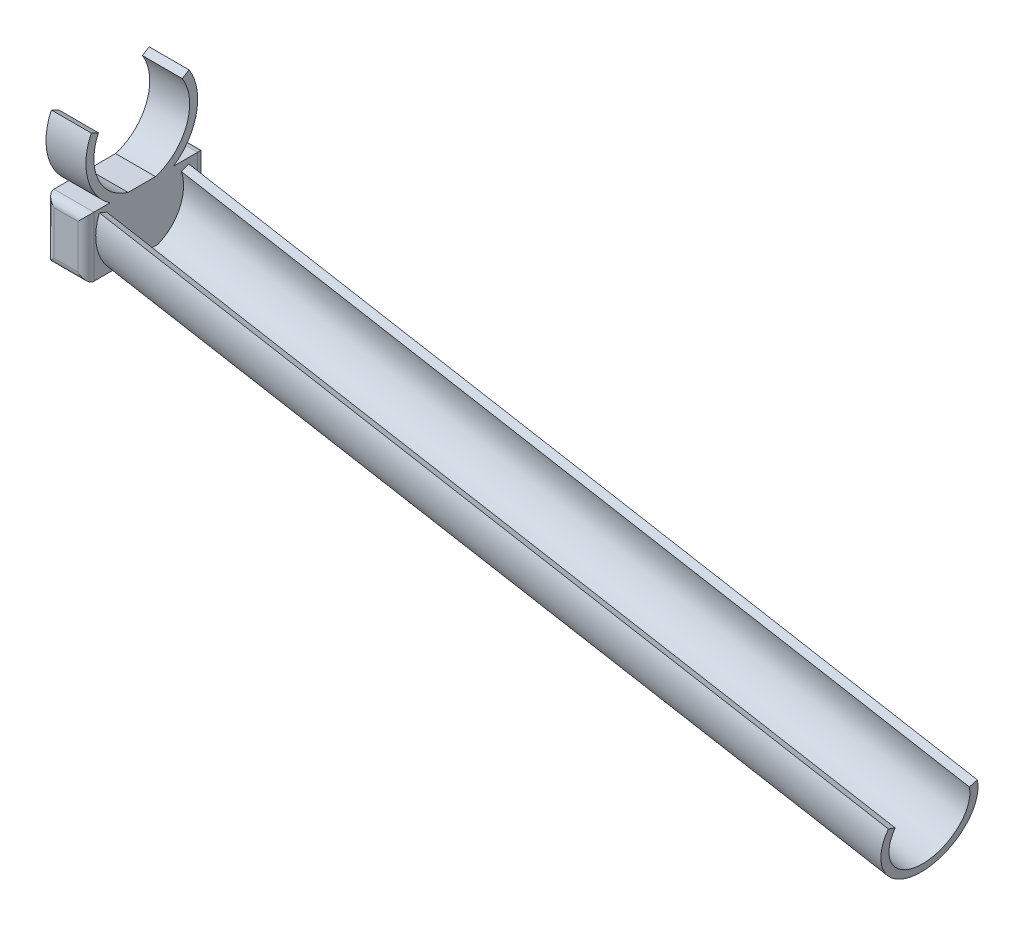
ISO-10303-21;
HEADER;
FILE_DESCRIPTION(('STEP AP214'),'2;1');
FILE_NAME('part.step','',(''),(''),'','','');
FILE_SCHEMA(('AUTOMOTIVE_DESIGN { 1 0 10303 214 1 1 1 1 }'));
ENDSEC;
DATA;
#1=APPLICATION_CONTEXT('core data for automotive mechanical design processes');
#2=APPLICATION_PROTOCOL_DEFINITION('international standard','automotive_design',2000,#1);
#3=PRODUCT_CONTEXT('',#1,'mechanical');
#4=PRODUCT('Part','Part','',(#3));
#5=PRODUCT_RELATED_PRODUCT_CATEGORY('part','',(#4));
#6=PRODUCT_DEFINITION_FORMATION('','',#4);
#7=PRODUCT_DEFINITION_CONTEXT('part definition',#1,'design');
#8=PRODUCT_DEFINITION('design','',#6,#7);
#9=PRODUCT_DEFINITION_SHAPE('','',#8);
#10=(LENGTH_UNIT() NAMED_UNIT(*) SI_UNIT(.MILLI.,.METRE.));
#11=(NAMED_UNIT(*) PLANE_ANGLE_UNIT() SI_UNIT($,.RADIAN.));
#12=(NAMED_UNIT(*) SI_UNIT($,.STERADIAN.) SOLID_ANGLE_UNIT());
#13=UNCERTAINTY_MEASURE_WITH_UNIT(LENGTH_MEASURE(1.E-05),#10,'distance_accuracy_value','');
#14=(GEOMETRIC_REPRESENTATION_CONTEXT(3) GLOBAL_UNCERTAINTY_ASSIGNED_CONTEXT((#13)) GLOBAL_UNIT_ASSIGNED_CONTEXT((#10,
#11,#12)) REPRESENTATION_CONTEXT('',''));
#15=CARTESIAN_POINT('',(0.,0.,0.));
#16=DIRECTION('',(0.,0.,1.));
#17=DIRECTION('',(1.,0.,0.));
#18=AXIS2_PLACEMENT_3D('',#15,#16,#17);
#19=CARTESIAN_POINT('',(10.,0.,0.));
#20=DIRECTION('',(-1.,0.,0.));
#21=DIRECTION('',(0.,0.,1.));
#22=AXIS2_PLACEMENT_3D('',#19,#20,#21);
#23=CYLINDRICAL_SURFACE('',#22,14.);
#24=DIRECTION('',(-1.,0.,0.));
#25=VECTOR('',#24,1.);
#26=CARTESIAN_POINT('',(10.,-11.5,7.98435971133566));
#27=LINE('',#26,#25);
#28=CARTESIAN_POINT('',(10.,-11.5,7.98435971133566));
#29=VERTEX_POINT('',#28);
#30=CARTESIAN_POINT('',(0.,-11.5,7.98435971133566));
#31=VERTEX_POINT('',#30);
#32=EDGE_CURVE('E275',#29,#31,#27,.T.);
#33=ORIENTED_EDGE('',*,*,#32,.F.);
#34=CARTESIAN_POINT('',(10.,0.,0.));
#35=DIRECTION('',(1.,0.,0.));
#36=DIRECTION('',(0.,0.,-1.));
#37=AXIS2_PLACEMENT_3D('',#34,#35,#36);
#38=CIRCLE('',#37,14.);
#39=CARTESIAN_POINT('',(10.,5.99003358971207,12.6538333161979));
#40=VERTEX_POINT('',#39);
#41=EDGE_CURVE('E279',#40,#29,#38,.T.);
#42=ORIENTED_EDGE('',*,*,#41,.F.);
#43=DIRECTION('',(-1.,0.,0.));
#44=VECTOR('',#43,1.);
#45=CARTESIAN_POINT('',(10.,5.99003358971207,12.6538333161979));
#46=LINE('',#45,#44);
#47=CARTESIAN_POINT('',(0.,5.99003358971207,12.6538333161979));
#48=VERTEX_POINT('',#47);
#49=EDGE_CURVE('E293',#40,#48,#46,.T.);
#50=ORIENTED_EDGE('',*,*,#49,.T.);
#51=CARTESIAN_POINT('',(0.,0.,0.));
#52=DIRECTION('',(1.,0.,0.));
#53=DIRECTION('',(0.,0.,-1.));
#54=AXIS2_PLACEMENT_3D('',#51,#52,#53);
#55=CIRCLE('',#54,14.);
#56=EDGE_CURVE('E294',#48,#31,#55,.T.);
#57=ORIENTED_EDGE('',*,*,#56,.T.);
#58=EDGE_LOOP('',(#33,#42,#50,#57));
#59=FACE_BOUND('',#58,.T.);
#60=ADVANCED_FACE('F43',(#59),#23,.T.);
#61=DIRECTION('',(-1.,0.,0.));
#62=VECTOR('',#61,1.);
#63=CARTESIAN_POINT('',(10.,-11.5,-7.98435971133566));
#64=LINE('',#63,#62);
#65=CARTESIAN_POINT('',(0.,-11.5,-7.98435971133566));
#66=VERTEX_POINT('',#65);
#67=CARTESIAN_POINT('',(10.,-11.5,-7.98435971133566));
#68=VERTEX_POINT('',#67);
#69=EDGE_CURVE('E272',#66,#68,#64,.F.);
#70=ORIENTED_EDGE('',*,*,#69,.F.);
#71=CARTESIAN_POINT('',(0.,7.46112155775379,-11.846166683802));
#72=VERTEX_POINT('',#71);
#73=EDGE_CURVE('E278',#66,#72,#55,.T.);
#74=ORIENTED_EDGE('',*,*,#73,.T.);
#75=DIRECTION('',(-1.,0.,0.));
#76=VECTOR('',#75,1.);
#77=CARTESIAN_POINT('',(10.,7.46112155775379,-11.846166683802));
#78=LINE('',#77,#76);
#79=CARTESIAN_POINT('',(10.,7.46112155775379,-11.846166683802));
#80=VERTEX_POINT('',#79);
#81=EDGE_CURVE('E313',#80,#72,#78,.T.);
#82=ORIENTED_EDGE('',*,*,#81,.F.);
#83=EDGE_CURVE('E283',#68,#80,#38,.T.);
#84=ORIENTED_EDGE('',*,*,#83,.F.);
#85=EDGE_LOOP('',(#70,#74,#82,#84));
#86=FACE_BOUND('',#85,.T.);
#87=ADVANCED_FACE('F399',(#86),#23,.T.);
#88=CARTESIAN_POINT('',(10.,0.,0.));
#89=DIRECTION('',(-1.,0.,0.));
#90=DIRECTION('',(0.,0.,1.));
#91=AXIS2_PLACEMENT_3D('',#88,#89,#90);
#92=CYLINDRICAL_SURFACE('',#91,12.);
#93=CARTESIAN_POINT('',(10.,0.,0.));
#94=DIRECTION('',(1.,0.,0.));
#95=DIRECTION('',(0.,0.,-1.));
#96=AXIS2_PLACEMENT_3D('',#93,#94,#95);
#97=CIRCLE('',#96,12.);
#98=CARTESIAN_POINT('',(10.,5.13431450546749,10.8461428424554));
#99=VERTEX_POINT('',#98);
#100=CARTESIAN_POINT('',(10.,-11.5,3.42782730020053));
#101=VERTEX_POINT('',#100);
#102=EDGE_CURVE('E287',#99,#101,#97,.T.);
#103=ORIENTED_EDGE('',*,*,#102,.T.);
#104=DIRECTION('',(-1.,0.,0.));
#105=VECTOR('',#104,1.);
#106=CARTESIAN_POINT('',(10.,-11.5,3.42782730020052));
#107=LINE('',#106,#105);
#108=CARTESIAN_POINT('',(0.,-11.5,3.42782730020053));
#109=VERTEX_POINT('',#108);
#110=EDGE_CURVE('E269',#101,#109,#107,.T.);
#111=ORIENTED_EDGE('',*,*,#110,.T.);
#112=CARTESIAN_POINT('',(0.,0.,0.));
#113=DIRECTION('',(1.,0.,0.));
#114=DIRECTION('',(0.,0.,-1.));
#115=AXIS2_PLACEMENT_3D('',#112,#113,#114);
#116=CIRCLE('',#115,12.);
#117=CARTESIAN_POINT('',(0.,5.13431450546749,10.8461428424554));
#118=VERTEX_POINT('',#117);
#119=EDGE_CURVE('E301',#118,#109,#116,.T.);
#120=ORIENTED_EDGE('',*,*,#119,.F.);
#121=DIRECTION('',(-1.,0.,0.));
#122=VECTOR('',#121,1.);
#123=CARTESIAN_POINT('',(10.,5.13431450546749,10.8461428424554));
#124=LINE('',#123,#122);
#125=EDGE_CURVE('E308',#99,#118,#124,.T.);
#126=ORIENTED_EDGE('',*,*,#125,.F.);
#127=EDGE_LOOP('',(#103,#111,#120,#126));
#128=FACE_BOUND('',#127,.T.);
#129=ADVANCED_FACE('F423',(#128),#92,.F.);
#130=CARTESIAN_POINT('',(0.,-11.5,-3.42782730020052));
#131=VERTEX_POINT('',#130);
#132=CARTESIAN_POINT('',(0.,6.39524704950325,-10.1538571575446));
#133=VERTEX_POINT('',#132);
#134=EDGE_CURVE('E300',#131,#133,#116,.T.);
#135=ORIENTED_EDGE('',*,*,#134,.F.);
#136=DIRECTION('',(-1.,0.,0.));
#137=VECTOR('',#136,1.);
#138=CARTESIAN_POINT('',(10.,-11.5,-3.42782730020052));
#139=LINE('',#138,#137);
#140=CARTESIAN_POINT('',(10.,-11.5,-3.42782730020052));
#141=VERTEX_POINT('',#140);
#142=EDGE_CURVE('E265',#131,#141,#139,.F.);
#143=ORIENTED_EDGE('',*,*,#142,.T.);
#144=CARTESIAN_POINT('',(10.,6.39524704950325,-10.1538571575446));
#145=VERTEX_POINT('',#144);
#146=EDGE_CURVE('E286',#141,#145,#97,.T.);
#147=ORIENTED_EDGE('',*,*,#146,.T.);
#148=DIRECTION('',(-1.,0.,0.));
#149=VECTOR('',#148,1.);
#150=CARTESIAN_POINT('',(10.,6.39524704950325,-10.1538571575446));
#151=LINE('',#150,#149);
#152=EDGE_CURVE('E310',#145,#133,#151,.T.);
#153=ORIENTED_EDGE('',*,*,#152,.T.);
#154=EDGE_LOOP('',(#135,#143,#147,#153));
#155=FACE_BOUND('',#154,.T.);
#156=ADVANCED_FACE('F416',(#155),#92,.F.);
#157=CARTESIAN_POINT('',(10.,6.39524704950325,-10.1538571575446));
#158=DIRECTION('',(0.,0.846154763128718,0.532937254125271));
#159=DIRECTION('',(0.,-0.532937254125271,0.846154763128718));
#160=AXIS2_PLACEMENT_3D('',#157,#158,#159);
#161=PLANE('',#160);
#162=DIRECTION('',(0.,0.532937254125271,-0.846154763128718));
#163=VECTOR('',#162,1.);
#164=CARTESIAN_POINT('',(0.,6.39524704950325,-10.1538571575446));
#165=LINE('',#164,#163);
#166=EDGE_CURVE('E297',#133,#72,#165,.T.);
#167=ORIENTED_EDGE('',*,*,#166,.F.);
#168=ORIENTED_EDGE('',*,*,#152,.F.);
#169=DIRECTION('',(0.,0.532937254125271,-0.846154763128718));
#170=VECTOR('',#169,1.);
#171=CARTESIAN_POINT('',(10.,6.39524704950325,-10.1538571575446));
#172=LINE('',#171,#170);
#173=EDGE_CURVE('E282',#145,#80,#172,.T.);
#174=ORIENTED_EDGE('',*,*,#173,.T.);
#175=ORIENTED_EDGE('',*,*,#81,.T.);
#176=EDGE_LOOP('',(#167,#168,#174,#175));
#177=FACE_BOUND('',#176,.T.);
#178=ADVANCED_FACE('F410',(#177),#161,.T.);
#179=CARTESIAN_POINT('',(10.,5.99003358971207,12.6538333161979));
#180=DIRECTION('',(0.,0.903845236871282,-0.427859542122291));
#181=DIRECTION('',(0.,0.427859542122291,0.903845236871282));
#182=AXIS2_PLACEMENT_3D('',#179,#180,#181);
#183=PLANE('',#182);
#184=DIRECTION('',(0.,-0.427859542122291,-0.903845236871282));
#185=VECTOR('',#184,1.);
#186=CARTESIAN_POINT('',(0.,5.99003358971207,12.6538333161979));
#187=LINE('',#186,#185);
#188=EDGE_CURVE('E304',#48,#118,#187,.T.);
#189=ORIENTED_EDGE('',*,*,#188,.F.);
#190=ORIENTED_EDGE('',*,*,#49,.F.);
#191=DIRECTION('',(0.,-0.427859542122291,-0.903845236871282));
#192=VECTOR('',#191,1.);
#193=CARTESIAN_POINT('',(10.,5.99003358971207,12.6538333161979));
#194=LINE('',#193,#192);
#195=EDGE_CURVE('E290',#40,#99,#194,.T.);
#196=ORIENTED_EDGE('',*,*,#195,.T.);
#197=ORIENTED_EDGE('',*,*,#125,.T.);
#198=EDGE_LOOP('',(#189,#190,#196,#197));
#199=FACE_BOUND('',#198,.T.);
#200=ADVANCED_FACE('F426',(#199),#183,.T.);
#201=CARTESIAN_POINT('',(10.,0.,0.));
#202=DIRECTION('',(1.,0.,0.));
#203=DIRECTION('',(0.,0.,-1.));
#204=AXIS2_PLACEMENT_3D('',#201,#202,#203);
#205=PLANE('',#204);
#206=DIRECTION('',(0.,0.,1.));
#207=VECTOR('',#206,1.);
#208=CARTESIAN_POINT('',(10.,-11.5,-16.));
#209=LINE('',#208,#207);
#210=CARTESIAN_POINT('',(10.,-11.5,12.));
#211=VERTEX_POINT('',#210);
#212=EDGE_CURVE('E258',#29,#211,#209,.T.);
#213=ORIENTED_EDGE('',*,*,#212,.T.);
#214=DIRECTION('',(0.,1.,0.));
#215=VECTOR('',#214,1.);
#216=CARTESIAN_POINT('',(10.,-26.5,12.));
#217=LINE('',#216,#215);
#218=CARTESIAN_POINT('',(10.,-26.5,12.));
#219=VERTEX_POINT('',#218);
#220=EDGE_CURVE('E343',#211,#219,#217,.F.);
#221=ORIENTED_EDGE('',*,*,#220,.T.);
#222=DIRECTION('',(0.,0.,1.));
#223=VECTOR('',#222,1.);
#224=CARTESIAN_POINT('',(10.,-26.5,-16.));
#225=LINE('',#224,#223);
#226=CARTESIAN_POINT('',(10.,-26.5,7.04434703166038));
#227=VERTEX_POINT('',#226);
#228=EDGE_CURVE('E255',#227,#219,#225,.T.);
#229=ORIENTED_EDGE('',*,*,#228,.F.);
#230=CARTESIAN_POINT('',(10.,-16.9946689853708,-0.463855675497438));
#231=DIRECTION('',(1.,0.,0.));
#232=DIRECTION('',(0.,-1.,0.));
#233=AXIS2_PLACEMENT_3D('',#230,#231,#232);
#234=ELLIPSE('',#233,12.1851193426289,12.);
#235=CARTESIAN_POINT('',(10.,-12.3320938629737,10.6228896802319));
#236=VERTEX_POINT('',#235);
#237=EDGE_CURVE('E242',#227,#236,#234,.F.);
#238=ORIENTED_EDGE('',*,*,#237,.T.);
#239=DIRECTION('',(0.,-0.387666544083796,-0.921799680298342));
#240=VECTOR('',#239,1.);
#241=CARTESIAN_POINT('',(10.,-14.2748599774965,6.00334948365908));
#242=LINE('',#241,#240);
#243=CARTESIAN_POINT('',(10.,-13.1091897167066,8.77509878761032));
#244=VERTEX_POINT('',#243);
#245=EDGE_CURVE('E327',#236,#244,#242,.T.);
#246=ORIENTED_EDGE('',*,*,#245,.T.);
#247=CARTESIAN_POINT('',(10.,-16.9946689853708,-0.463855675497438));
#248=DIRECTION('',(1.,0.,0.));
#249=DIRECTION('',(0.,-1.,0.));
#250=AXIS2_PLACEMENT_3D('',#247,#248,#249);
#251=ELLIPSE('',#250,10.1542661188574,10.);
#252=CARTESIAN_POINT('',(10.,-26.5,3.05368720153647));
#253=VERTEX_POINT('',#252);
#254=EDGE_CURVE('E212',#253,#244,#251,.F.);
#255=ORIENTED_EDGE('',*,*,#254,.F.);
#256=CARTESIAN_POINT('',(10.,-26.5,-3.98139855253135));
#257=VERTEX_POINT('',#256);
#258=EDGE_CURVE('E254',#257,#253,#225,.T.);
#259=ORIENTED_EDGE('',*,*,#258,.F.);
#260=CARTESIAN_POINT('',(10.,-13.6221931417264,-9.89621288282376));
#261=VERTEX_POINT('',#260);
#262=EDGE_CURVE('E250',#261,#257,#251,.F.);
#263=ORIENTED_EDGE('',*,*,#262,.F.);
#264=DIRECTION('',(0.,0.336670762544275,-0.941622428390412));
#265=VECTOR('',#264,1.);
#266=CARTESIAN_POINT('',(10.,-15.2154208155166,-5.44017131914373));
#267=LINE('',#266,#265);
#268=CARTESIAN_POINT('',(10.,-12.9476979729974,-11.782684324289));
#269=VERTEX_POINT('',#268);
#270=EDGE_CURVE('E329',#261,#269,#267,.T.);
#271=ORIENTED_EDGE('',*,*,#270,.T.);
#272=CARTESIAN_POINT('',(10.,-26.5,-7.97205838265526));
#273=VERTEX_POINT('',#272);
#274=EDGE_CURVE('E248',#269,#273,#234,.F.);
#275=ORIENTED_EDGE('',*,*,#274,.T.);
#276=CARTESIAN_POINT('',(10.,-26.5,-14.));
#277=VERTEX_POINT('',#276);
#278=EDGE_CURVE('E251',#277,#273,#225,.T.);
#279=ORIENTED_EDGE('',*,*,#278,.F.);
#280=DIRECTION('',(0.,1.,0.));
#281=VECTOR('',#280,1.);
#282=CARTESIAN_POINT('',(10.,-11.5,-14.));
#283=LINE('',#282,#281);
#284=CARTESIAN_POINT('',(10.,-11.5,-14.));
#285=VERTEX_POINT('',#284);
#286=EDGE_CURVE('E341',#277,#285,#283,.T.);
#287=ORIENTED_EDGE('',*,*,#286,.T.);
#288=EDGE_CURVE('E259',#285,#68,#209,.T.);
#289=ORIENTED_EDGE('',*,*,#288,.T.);
#290=ORIENTED_EDGE('',*,*,#83,.T.);
#291=ORIENTED_EDGE('',*,*,#173,.F.);
#292=ORIENTED_EDGE('',*,*,#146,.F.);
#293=EDGE_CURVE('E262',#141,#101,#209,.T.);
#294=ORIENTED_EDGE('',*,*,#293,.T.);
#295=ORIENTED_EDGE('',*,*,#102,.F.);
#296=ORIENTED_EDGE('',*,*,#195,.F.);
#297=ORIENTED_EDGE('',*,*,#41,.T.);
#298=EDGE_LOOP('',(#213,#221,#229,#238,#246,#255,#259,#263,#271,#275,#279,#287,#289,#290,#291,
#292,#294,#295,#296,#297));
#299=FACE_BOUND('',#298,.T.);
#300=ADVANCED_FACE('F390',(#299),#205,.T.);
#301=CARTESIAN_POINT('',(0.,0.,0.));
#302=DIRECTION('',(1.,0.,0.));
#303=DIRECTION('',(0.,0.,-1.));
#304=AXIS2_PLACEMENT_3D('',#301,#302,#303);
#305=PLANE('',#304);
#306=DIRECTION('',(0.,0.,-1.));
#307=VECTOR('',#306,1.);
#308=CARTESIAN_POINT('',(0.,-26.5,14.));
#309=LINE('',#308,#307);
#310=CARTESIAN_POINT('',(0.,-26.5,12.));
#311=VERTEX_POINT('',#310);
#312=CARTESIAN_POINT('',(0.,-26.5,-14.));
#313=VERTEX_POINT('',#312);
#314=EDGE_CURVE('E253',#311,#313,#309,.T.);
#315=ORIENTED_EDGE('',*,*,#314,.F.);
#316=DIRECTION('',(0.,1.,0.));
#317=VECTOR('',#316,1.);
#318=CARTESIAN_POINT('',(0.,0.,12.));
#319=LINE('',#318,#317);
#320=CARTESIAN_POINT('',(0.,-11.5,12.));
#321=VERTEX_POINT('',#320);
#322=EDGE_CURVE('E353',#311,#321,#319,.T.);
#323=ORIENTED_EDGE('',*,*,#322,.T.);
#324=DIRECTION('',(0.,0.,-1.));
#325=VECTOR('',#324,1.);
#326=CARTESIAN_POINT('',(0.,-11.5,-16.));
#327=LINE('',#326,#325);
#328=EDGE_CURVE('E263',#321,#31,#327,.T.);
#329=ORIENTED_EDGE('',*,*,#328,.T.);
#330=ORIENTED_EDGE('',*,*,#56,.F.);
#331=ORIENTED_EDGE('',*,*,#188,.T.);
#332=ORIENTED_EDGE('',*,*,#119,.T.);
#333=EDGE_CURVE('E266',#109,#131,#327,.T.);
#334=ORIENTED_EDGE('',*,*,#333,.T.);
#335=ORIENTED_EDGE('',*,*,#134,.T.);
#336=ORIENTED_EDGE('',*,*,#166,.T.);
#337=ORIENTED_EDGE('',*,*,#73,.F.);
#338=CARTESIAN_POINT('',(0.,-11.5,-14.));
#339=VERTEX_POINT('',#338);
#340=EDGE_CURVE('E261',#66,#339,#327,.T.);
#341=ORIENTED_EDGE('',*,*,#340,.T.);
#342=DIRECTION('',(0.,1.,0.));
#343=VECTOR('',#342,1.);
#344=CARTESIAN_POINT('',(0.,0.,-14.));
#345=LINE('',#344,#343);
#346=EDGE_CURVE('E350',#339,#313,#345,.F.);
#347=ORIENTED_EDGE('',*,*,#346,.T.);
#348=EDGE_LOOP('',(#315,#323,#329,#330,#331,#332,#334,#335,#336,#337,#341,#347));
#349=FACE_BOUND('',#348,.T.);
#350=ADVANCED_FACE('F403',(#349),#305,.F.);
#351=CARTESIAN_POINT('',(0.,-11.5,0.));
#352=DIRECTION('',(0.,-1.,0.));
#353=DIRECTION('',(0.,0.,-1.));
#354=AXIS2_PLACEMENT_3D('',#351,#352,#353);
#355=PLANE('',#354);
#356=ORIENTED_EDGE('',*,*,#110,.F.);
#357=ORIENTED_EDGE('',*,*,#293,.F.);
#358=ORIENTED_EDGE('',*,*,#142,.F.);
#359=ORIENTED_EDGE('',*,*,#333,.F.);
#360=EDGE_LOOP('',(#356,#357,#358,#359));
#361=FACE_BOUND('',#360,.T.);
#362=ADVANCED_FACE('F418',(#361),#355,.F.);
#363=ORIENTED_EDGE('',*,*,#328,.F.);
#364=DIRECTION('',(-1.,0.,0.));
#365=VECTOR('',#364,1.);
#366=CARTESIAN_POINT('',(0.,-11.5,12.));
#367=LINE('',#366,#365);
#368=EDGE_CURVE('E355',#321,#211,#367,.F.);
#369=ORIENTED_EDGE('',*,*,#368,.T.);
#370=ORIENTED_EDGE('',*,*,#212,.F.);
#371=ORIENTED_EDGE('',*,*,#32,.T.);
#372=EDGE_LOOP('',(#363,#369,#370,#371));
#373=FACE_BOUND('',#372,.T.);
#374=ADVANCED_FACE('F433',(#373),#355,.F.);
#375=ORIENTED_EDGE('',*,*,#288,.F.);
#376=DIRECTION('',(1.,0.,0.));
#377=VECTOR('',#376,1.);
#378=CARTESIAN_POINT('',(0.,-11.5,-14.));
#379=LINE('',#378,#377);
#380=EDGE_CURVE('E11',#285,#339,#379,.F.);
#381=ORIENTED_EDGE('',*,*,#380,.T.);
#382=ORIENTED_EDGE('',*,*,#340,.F.);
#383=ORIENTED_EDGE('',*,*,#69,.T.);
#384=EDGE_LOOP('',(#375,#381,#382,#383));
#385=FACE_BOUND('',#384,.T.);
#386=ADVANCED_FACE('F394',(#385),#355,.F.);
#387=CARTESIAN_POINT('',(10.,-16.5,14.));
#388=DIRECTION('',(0.,0.,-1.));
#389=DIRECTION('',(-1.,0.,0.));
#390=AXIS2_PLACEMENT_3D('',#387,#388,#389);
#391=PLANE('',#390);
#392=DIRECTION('',(-1.,0.,0.));
#393=VECTOR('',#392,1.);
#394=CARTESIAN_POINT('',(10.,-24.5,14.));
#395=LINE('',#394,#393);
#396=CARTESIAN_POINT('',(2.,-24.5,14.));
#397=VERTEX_POINT('',#396);
#398=CARTESIAN_POINT('',(8.,-24.5,14.));
#399=VERTEX_POINT('',#398);
#400=EDGE_CURVE('E336',#397,#399,#395,.F.);
#401=ORIENTED_EDGE('',*,*,#400,.T.);
#402=DIRECTION('',(0.,1.,0.));
#403=VECTOR('',#402,1.);
#404=CARTESIAN_POINT('',(8.,-11.5,14.));
#405=LINE('',#404,#403);
#406=CARTESIAN_POINT('',(8.,-13.5,14.));
#407=VERTEX_POINT('',#406);
#408=EDGE_CURVE('E338',#399,#407,#405,.T.);
#409=ORIENTED_EDGE('',*,*,#408,.T.);
#410=DIRECTION('',(-1.,0.,0.));
#411=VECTOR('',#410,1.);
#412=CARTESIAN_POINT('',(10.,-13.5,14.));
#413=LINE('',#412,#411);
#414=CARTESIAN_POINT('',(2.,-13.5,14.));
#415=VERTEX_POINT('',#414);
#416=EDGE_CURVE('E332',#407,#415,#413,.T.);
#417=ORIENTED_EDGE('',*,*,#416,.T.);
#418=DIRECTION('',(0.,1.,0.));
#419=VECTOR('',#418,1.);
#420=CARTESIAN_POINT('',(2.,-16.5,14.));
#421=LINE('',#420,#419);
#422=EDGE_CURVE('E334',#415,#397,#421,.F.);
#423=ORIENTED_EDGE('',*,*,#422,.T.);
#424=EDGE_LOOP('',(#401,#409,#417,#423));
#425=FACE_BOUND('',#424,.T.);
#426=ADVANCED_FACE('F474',(#425),#391,.F.);
#427=CARTESIAN_POINT('',(10.,-16.5,-16.));
#428=DIRECTION('',(0.,0.,1.));
#429=DIRECTION('',(1.,0.,0.));
#430=AXIS2_PLACEMENT_3D('',#427,#428,#429);
#431=PLANE('',#430);
#432=DIRECTION('',(1.,0.,0.));
#433=VECTOR('',#432,1.);
#434=CARTESIAN_POINT('',(0.,-24.5,-16.));
#435=LINE('',#434,#433);
#436=CARTESIAN_POINT('',(8.,-24.5,-16.));
#437=VERTEX_POINT('',#436);
#438=CARTESIAN_POINT('',(2.,-24.5,-16.));
#439=VERTEX_POINT('',#438);
#440=EDGE_CURVE('E60',#437,#439,#435,.F.);
#441=ORIENTED_EDGE('',*,*,#440,.T.);
#442=DIRECTION('',(0.,1.,0.));
#443=VECTOR('',#442,1.);
#444=CARTESIAN_POINT('',(2.,-16.5,-16.));
#445=LINE('',#444,#443);
#446=CARTESIAN_POINT('',(2.,-13.5,-16.));
#447=VERTEX_POINT('',#446);
#448=EDGE_CURVE('E52',#439,#447,#445,.T.);
#449=ORIENTED_EDGE('',*,*,#448,.T.);
#450=DIRECTION('',(1.,0.,0.));
#451=VECTOR('',#450,1.);
#452=CARTESIAN_POINT('',(10.,-13.5,-16.));
#453=LINE('',#452,#451);
#454=CARTESIAN_POINT('',(8.,-13.5,-16.));
#455=VERTEX_POINT('',#454);
#456=EDGE_CURVE('E357',#447,#455,#453,.T.);
#457=ORIENTED_EDGE('',*,*,#456,.T.);
#458=DIRECTION('',(0.,1.,0.));
#459=VECTOR('',#458,1.);
#460=CARTESIAN_POINT('',(8.,-26.5,-16.));
#461=LINE('',#460,#459);
#462=EDGE_CURVE('E65',#455,#437,#461,.F.);
#463=ORIENTED_EDGE('',*,*,#462,.T.);
#464=EDGE_LOOP('',(#441,#449,#457,#463));
#465=FACE_BOUND('',#464,.T.);
#466=ADVANCED_FACE('F476',(#465),#431,.F.);
#467=CARTESIAN_POINT('',(0.,-26.5,0.));
#468=DIRECTION('',(0.,-1.,0.));
#469=DIRECTION('',(0.,0.,-1.));
#470=AXIS2_PLACEMENT_3D('',#467,#468,#469);
#471=PLANE('',#470);
#472=ORIENTED_EDGE('',*,*,#228,.T.);
#473=DIRECTION('',(-1.,0.,0.));
#474=VECTOR('',#473,1.);
#475=CARTESIAN_POINT('',(0.,-26.5,12.));
#476=LINE('',#475,#474);
#477=EDGE_CURVE('E348',#219,#311,#476,.T.);
#478=ORIENTED_EDGE('',*,*,#477,.T.);
#479=ORIENTED_EDGE('',*,*,#314,.T.);
#480=DIRECTION('',(1.,0.,0.));
#481=VECTOR('',#480,1.);
#482=CARTESIAN_POINT('',(10.,-26.5,-14.));
#483=LINE('',#482,#481);
#484=EDGE_CURVE('E346',#313,#277,#483,.T.);
#485=ORIENTED_EDGE('',*,*,#484,.T.);
#486=ORIENTED_EDGE('',*,*,#278,.T.);
#487=CARTESIAN_POINT('',(63.9074109727146,-26.5,-0.463855675497431));
#488=DIRECTION('',(0.,-1.,0.));
#489=DIRECTION('',(1.,0.,0.));
#490=AXIS2_PLACEMENT_3D('',#487,#488,#489);
#491=ELLIPSE('',#490,69.1052457977235,12.);
#492=CARTESIAN_POINT('',(7.2213035810296,-26.5,-7.32728803684891));
#493=VERTEX_POINT('',#492);
#494=EDGE_CURVE('E324',#273,#493,#491,.F.);
#495=ORIENTED_EDGE('',*,*,#494,.T.);
#496=DIRECTION('',(0.,0.,1.));
#497=VECTOR('',#496,1.);
#498=CARTESIAN_POINT('',(7.2213035810296,-26.5,0.));
#499=LINE('',#498,#497);
#500=CARTESIAN_POINT('',(7.2213035810296,-26.5,-2.22644007882302));
#501=VERTEX_POINT('',#500);
#502=EDGE_CURVE('E320',#493,#501,#499,.T.);
#503=ORIENTED_EDGE('',*,*,#502,.T.);
#504=CARTESIAN_POINT('',(63.9074109727146,-26.5,-0.463855675497431));
#505=DIRECTION('',(0.,-1.,0.));
#506=DIRECTION('',(1.,0.,0.));
#507=AXIS2_PLACEMENT_3D('',#504,#505,#506);
#508=ELLIPSE('',#507,57.5877048314362,10.);
#509=EDGE_CURVE('E326',#257,#501,#508,.F.);
#510=ORIENTED_EDGE('',*,*,#509,.F.);
#511=ORIENTED_EDGE('',*,*,#258,.T.);
#512=CARTESIAN_POINT('',(7.2213035810296,-26.5,1.29872872782815));
#513=VERTEX_POINT('',#512);
#514=EDGE_CURVE('E323',#513,#253,#508,.F.);
#515=ORIENTED_EDGE('',*,*,#514,.F.);
#516=CARTESIAN_POINT('',(7.2213035810296,-26.5,6.39957668585403));
#517=VERTEX_POINT('',#516);
#518=EDGE_CURVE('E316',#513,#517,#499,.T.);
#519=ORIENTED_EDGE('',*,*,#518,.T.);
#520=EDGE_CURVE('E319',#517,#227,#491,.F.);
#521=ORIENTED_EDGE('',*,*,#520,.T.);
#522=EDGE_LOOP('',(#472,#478,#479,#485,#486,#495,#503,#510,#511,#515,#519,#521));
#523=FACE_BOUND('',#522,.T.);
#524=ADVANCED_FACE('F448',(#523),#471,.T.);
#525=CARTESIAN_POINT('',(8.93059886835014,-16.8061047126608,-0.463855675497438));
#526=DIRECTION('',(0.984807753012208,-0.173648177666931,0.));
#527=DIRECTION('',(0.173648177666931,0.984807753012208,0.));
#528=AXIS2_PLACEMENT_3D('',#525,#526,#527);
#529=CYLINDRICAL_SURFACE('',#528,10.);
#530=DIRECTION('',(0.984807753012208,-0.173648177666931,0.));
#531=VECTOR('',#530,1.);
#532=CARTESIAN_POINT('',(9.50732620405297,-13.5353214588128,-9.89621288282376));
#533=LINE('',#532,#531);
#534=CARTESIAN_POINT('',(207.453684559507,-48.4386051698659,-9.89621288282374));
#535=VERTEX_POINT('',#534);
#536=EDGE_CURVE('E240',#261,#535,#533,.T.);
#537=ORIENTED_EDGE('',*,*,#536,.F.);
#538=ORIENTED_EDGE('',*,*,#262,.T.);
#539=ORIENTED_EDGE('',*,*,#509,.T.);
#540=CARTESIAN_POINT('',(8.93059886835014,-16.8061047126608,-0.463855675497438));
#541=DIRECTION('',(0.984807753012208,-0.173648177666931,0.));
#542=DIRECTION('',(0.,0.,1.));
#543=AXIS2_PLACEMENT_3D('',#540,#541,#542);
#544=CIRCLE('',#543,10.);
#545=EDGE_CURVE('E236',#501,#513,#544,.F.);
#546=ORIENTED_EDGE('',*,*,#545,.T.);
#547=ORIENTED_EDGE('',*,*,#514,.T.);
#548=ORIENTED_EDGE('',*,*,#254,.T.);
#549=DIRECTION('',(0.984807753012208,-0.173648177666931,0.));
#550=VECTOR('',#549,1.);
#551=CARTESIAN_POINT('',(9.59505495652888,-13.0377869798384,8.77509878761032));
#552=LINE('',#551,#550);
#553=CARTESIAN_POINT('',(207.541413311983,-47.9410706908915,8.77509878761034));
#554=VERTEX_POINT('',#553);
#555=EDGE_CURVE('E205',#244,#554,#552,.T.);
#556=ORIENTED_EDGE('',*,*,#555,.T.);
#557=CARTESIAN_POINT('',(206.876957223804,-51.7093884237139,-0.463855675497415));
#558=DIRECTION('',(0.984807753012208,-0.173648177666931,0.));
#559=DIRECTION('',(0.,0.,1.));
#560=AXIS2_PLACEMENT_3D('',#557,#558,#559);
#561=CIRCLE('',#560,10.);
#562=EDGE_CURVE('E209',#535,#554,#561,.F.);
#563=ORIENTED_EDGE('',*,*,#562,.F.);
#564=EDGE_LOOP('',(#537,#538,#539,#546,#547,#548,#556,#563));
#565=FACE_BOUND('',#564,.T.);
#566=ADVANCED_FACE('F208',(#565),#529,.F.);
#567=CARTESIAN_POINT('',(9.50732620405297,-13.5353214588128,-9.89621288282376));
#568=DIRECTION('',(-0.163791164015575,-0.928905850695554,-0.332124035766749));
#569=DIRECTION('',(0.,0.336670762544275,-0.941622428390412));
#570=AXIS2_PLACEMENT_3D('',#567,#568,#569);
#571=PLANE('',#570);
#572=ORIENTED_EDGE('',*,*,#270,.F.);
#573=ORIENTED_EDGE('',*,*,#536,.T.);
#574=DIRECTION('',(0.0576727335702826,0.327078325384798,-0.943235720732632));
#575=VECTOR('',#574,1.);
#576=CARTESIAN_POINT('',(207.453684559507,-48.4386051698659,-9.89621288282374));
#577=LINE('',#576,#575);
#578=CARTESIAN_POINT('',(207.569030026647,-47.7844485190963,-11.782684324289));
#579=VERTEX_POINT('',#578);
#580=EDGE_CURVE('E226',#535,#579,#577,.T.);
#581=ORIENTED_EDGE('',*,*,#580,.T.);
#582=DIRECTION('',(0.984807753012208,-0.173648177666931,0.));
#583=VECTOR('',#582,1.);
#584=CARTESIAN_POINT('',(9.62267167119353,-12.8811648080432,-11.782684324289));
#585=LINE('',#584,#583);
#586=EDGE_CURVE('E243',#269,#579,#585,.T.);
#587=ORIENTED_EDGE('',*,*,#586,.F.);
#588=EDGE_LOOP('',(#572,#573,#581,#587));
#589=FACE_BOUND('',#588,.T.);
#590=ADVANCED_FACE('F462',(#589),#571,.F.);
#591=CARTESIAN_POINT('',(8.93059886835014,-16.8061047126608,-0.463855675497438));
#592=DIRECTION('',(0.984807753012208,-0.173648177666931,0.));
#593=DIRECTION('',(0.173648177666931,0.984807753012208,0.));
#594=AXIS2_PLACEMENT_3D('',#591,#592,#593);
#595=CYLINDRICAL_SURFACE('',#594,12.);
#596=ORIENTED_EDGE('',*,*,#274,.F.);
#597=ORIENTED_EDGE('',*,*,#586,.T.);
#598=CARTESIAN_POINT('',(206.876957223804,-51.7093884237139,-0.463855675497415));
#599=DIRECTION('',(-0.984807753012208,0.173648177666931,0.));
#600=DIRECTION('',(-0.173648177666931,-0.984807753012208,0.));
#601=AXIS2_PLACEMENT_3D('',#598,#599,#600);
#602=CIRCLE('',#601,12.);
#603=CARTESIAN_POINT('',(207.674304529618,-47.187407144327,10.6228896802319));
#604=VERTEX_POINT('',#603);
#605=EDGE_CURVE('E231',#579,#604,#602,.T.);
#606=ORIENTED_EDGE('',*,*,#605,.T.);
#607=DIRECTION('',(0.984807753012208,-0.173648177666931,0.));
#608=VECTOR('',#607,1.);
#609=CARTESIAN_POINT('',(9.72794617416463,-12.284123433274,10.6228896802319));
#610=LINE('',#609,#608);
#611=EDGE_CURVE('E216',#236,#604,#610,.T.);
#612=ORIENTED_EDGE('',*,*,#611,.F.);
#613=ORIENTED_EDGE('',*,*,#237,.F.);
#614=ORIENTED_EDGE('',*,*,#520,.F.);
#615=CARTESIAN_POINT('',(8.93059886835014,-16.8061047126608,-0.463855675497438));
#616=DIRECTION('',(-0.984807753012208,0.173648177666931,0.));
#617=DIRECTION('',(-0.173648177666931,-0.984807753012208,0.));
#618=AXIS2_PLACEMENT_3D('',#615,#616,#617);
#619=CIRCLE('',#618,12.);
#620=EDGE_CURVE('E217',#493,#517,#619,.T.);
#621=ORIENTED_EDGE('',*,*,#620,.F.);
#622=ORIENTED_EDGE('',*,*,#494,.F.);
#623=EDGE_LOOP('',(#596,#597,#606,#612,#613,#614,#621,#622));
#624=FACE_BOUND('',#623,.T.);
#625=ADVANCED_FACE('F459',(#624),#595,.T.);
#626=CARTESIAN_POINT('',(9.72794617416463,-12.284123433274,10.6228896802319));
#627=DIRECTION('',(-0.160432760606642,-0.909859398499527,0.382645010794876));
#628=DIRECTION('',(0.,-0.387666544083796,-0.921799680298342));
#629=AXIS2_PLACEMENT_3D('',#626,#627,#628);
#630=PLANE('',#629);
#631=ORIENTED_EDGE('',*,*,#245,.F.);
#632=ORIENTED_EDGE('',*,*,#611,.T.);
#633=DIRECTION('',(-0.0664456088178732,-0.376831773282234,-0.923895446310777));
#634=VECTOR('',#633,1.);
#635=CARTESIAN_POINT('',(207.674304529618,-47.187407144327,10.6228896802319));
#636=LINE('',#635,#634);
#637=EDGE_CURVE('E223',#604,#554,#636,.T.);
#638=ORIENTED_EDGE('',*,*,#637,.T.);
#639=ORIENTED_EDGE('',*,*,#555,.F.);
#640=EDGE_LOOP('',(#631,#632,#638,#639));
#641=FACE_BOUND('',#640,.T.);
#642=ADVANCED_FACE('F229',(#641),#630,.F.);
#643=CARTESIAN_POINT('',(8.93059886835014,-16.8061047126608,-0.463855675497438));
#644=DIRECTION('',(0.984807753012208,-0.173648177666931,0.));
#645=DIRECTION('',(0.,0.,1.));
#646=AXIS2_PLACEMENT_3D('',#643,#644,#645);
#647=PLANE('',#646);
#648=ORIENTED_EDGE('',*,*,#502,.F.);
#649=ORIENTED_EDGE('',*,*,#620,.T.);
#650=ORIENTED_EDGE('',*,*,#518,.F.);
#651=ORIENTED_EDGE('',*,*,#545,.F.);
#652=EDGE_LOOP('',(#648,#649,#650,#651));
#653=FACE_BOUND('',#652,.T.);
#654=ADVANCED_FACE('F588',(#653),#647,.F.);
#655=CARTESIAN_POINT('',(206.876957223804,-51.7093884237139,-0.463855675497415));
#656=DIRECTION('',(0.984807753012208,-0.173648177666931,0.));
#657=DIRECTION('',(0.,0.,1.));
#658=AXIS2_PLACEMENT_3D('',#655,#656,#657);
#659=PLANE('',#658);
#660=ORIENTED_EDGE('',*,*,#562,.T.);
#661=ORIENTED_EDGE('',*,*,#637,.F.);
#662=ORIENTED_EDGE('',*,*,#605,.F.);
#663=ORIENTED_EDGE('',*,*,#580,.F.);
#664=EDGE_LOOP('',(#660,#661,#662,#663));
#665=FACE_BOUND('',#664,.T.);
#666=ADVANCED_FACE('F221',(#665),#659,.T.);
#667=CARTESIAN_POINT('',(2.,0.,12.));
#668=DIRECTION('',(0.,1.,0.));
#669=DIRECTION('',(0.,0.,1.));
#670=AXIS2_PLACEMENT_3D('',#667,#668,#669);
#671=CYLINDRICAL_SURFACE('',#670,2.);
#672=CARTESIAN_POINT('',(2.,-13.5,12.));
#673=DIRECTION('',(-0.707106781186547,-0.707106781186547,0.));
#674=DIRECTION('',(-0.707106781186547,0.707106781186547,0.));
#675=AXIS2_PLACEMENT_3D('',#672,#673,#674);
#676=ELLIPSE('',#675,2.82842712474619,2.);
#677=EDGE_CURVE('E366',#321,#415,#676,.F.);
#678=ORIENTED_EDGE('',*,*,#677,.F.);
#679=ORIENTED_EDGE('',*,*,#322,.F.);
#680=CARTESIAN_POINT('',(2.,-24.5,12.));
#681=DIRECTION('',(-0.707106781186547,0.707106781186547,0.));
#682=DIRECTION('',(0.707106781186547,0.707106781186547,0.));
#683=AXIS2_PLACEMENT_3D('',#680,#681,#682);
#684=ELLIPSE('',#683,2.82842712474619,2.);
#685=EDGE_CURVE('E227',#397,#311,#684,.F.);
#686=ORIENTED_EDGE('',*,*,#685,.F.);
#687=ORIENTED_EDGE('',*,*,#422,.F.);
#688=EDGE_LOOP('',(#678,#679,#686,#687));
#689=FACE_BOUND('',#688,.T.);
#690=ADVANCED_FACE('F468',(#689),#671,.T.);
#691=CARTESIAN_POINT('',(0.,-24.5,12.));
#692=DIRECTION('',(1.,0.,0.));
#693=DIRECTION('',(0.,0.,-1.));
#694=AXIS2_PLACEMENT_3D('',#691,#692,#693);
#695=CYLINDRICAL_SURFACE('',#694,2.);
#696=ORIENTED_EDGE('',*,*,#685,.T.);
#697=ORIENTED_EDGE('',*,*,#477,.F.);
#698=CARTESIAN_POINT('',(8.,-24.5,12.));
#699=DIRECTION('',(0.707106781186547,0.707106781186547,0.));
#700=DIRECTION('',(0.707106781186547,-0.707106781186547,0.));
#701=AXIS2_PLACEMENT_3D('',#698,#699,#700);
#702=ELLIPSE('',#701,2.82842712474619,2.);
#703=EDGE_CURVE('E364',#399,#219,#702,.T.);
#704=ORIENTED_EDGE('',*,*,#703,.F.);
#705=ORIENTED_EDGE('',*,*,#400,.F.);
#706=EDGE_LOOP('',(#696,#697,#704,#705));
#707=FACE_BOUND('',#706,.T.);
#708=ADVANCED_FACE('F472',(#707),#695,.T.);
#709=CARTESIAN_POINT('',(10.,-13.5,12.));
#710=DIRECTION('',(-1.,0.,0.));
#711=DIRECTION('',(0.,0.,1.));
#712=AXIS2_PLACEMENT_3D('',#709,#710,#711);
#713=CYLINDRICAL_SURFACE('',#712,2.);
#714=ORIENTED_EDGE('',*,*,#677,.T.);
#715=ORIENTED_EDGE('',*,*,#416,.F.);
#716=CARTESIAN_POINT('',(8.,-13.5,12.));
#717=DIRECTION('',(-0.707106781186547,0.707106781186547,0.));
#718=DIRECTION('',(-0.707106781186547,-0.707106781186547,0.));
#719=AXIS2_PLACEMENT_3D('',#716,#717,#718);
#720=ELLIPSE('',#719,2.82842712474619,2.);
#721=EDGE_CURVE('E362',#211,#407,#720,.F.);
#722=ORIENTED_EDGE('',*,*,#721,.F.);
#723=ORIENTED_EDGE('',*,*,#368,.F.);
#724=EDGE_LOOP('',(#714,#715,#722,#723));
#725=FACE_BOUND('',#724,.T.);
#726=ADVANCED_FACE('F438',(#725),#713,.T.);
#727=CARTESIAN_POINT('',(8.,-16.5,12.));
#728=DIRECTION('',(0.,-1.,0.));
#729=DIRECTION('',(0.,0.,-1.));
#730=AXIS2_PLACEMENT_3D('',#727,#728,#729);
#731=CYLINDRICAL_SURFACE('',#730,2.);
#732=ORIENTED_EDGE('',*,*,#703,.T.);
#733=ORIENTED_EDGE('',*,*,#220,.F.);
#734=ORIENTED_EDGE('',*,*,#721,.T.);
#735=ORIENTED_EDGE('',*,*,#408,.F.);
#736=EDGE_LOOP('',(#732,#733,#734,#735));
#737=FACE_BOUND('',#736,.T.);
#738=ADVANCED_FACE('F442',(#737),#731,.T.);
#739=CARTESIAN_POINT('',(8.,0.,-14.));
#740=DIRECTION('',(0.,-1.,0.));
#741=DIRECTION('',(0.,0.,-1.));
#742=AXIS2_PLACEMENT_3D('',#739,#740,#741);
#743=CYLINDRICAL_SURFACE('',#742,2.);
#744=CARTESIAN_POINT('',(8.,-13.5,-14.));
#745=DIRECTION('',(0.707106781186547,-0.707106781186547,0.));
#746=DIRECTION('',(0.707106781186547,0.707106781186547,0.));
#747=AXIS2_PLACEMENT_3D('',#744,#745,#746);
#748=ELLIPSE('',#747,2.82842712474619,2.);
#749=EDGE_CURVE('E374',#285,#455,#748,.F.);
#750=ORIENTED_EDGE('',*,*,#749,.F.);
#751=ORIENTED_EDGE('',*,*,#286,.F.);
#752=CARTESIAN_POINT('',(8.,-24.5,-14.));
#753=DIRECTION('',(-0.707106781186547,-0.707106781186547,0.));
#754=DIRECTION('',(0.707106781186547,-0.707106781186547,0.));
#755=AXIS2_PLACEMENT_3D('',#752,#753,#754);
#756=ELLIPSE('',#755,2.82842712474619,2.);
#757=EDGE_CURVE('E47',#437,#277,#756,.T.);
#758=ORIENTED_EDGE('',*,*,#757,.F.);
#759=ORIENTED_EDGE('',*,*,#462,.F.);
#760=EDGE_LOOP('',(#750,#751,#758,#759));
#761=FACE_BOUND('',#760,.T.);
#762=ADVANCED_FACE('F45',(#761),#743,.T.);
#763=CARTESIAN_POINT('',(0.,-24.5,-14.));
#764=DIRECTION('',(-1.,0.,0.));
#765=DIRECTION('',(0.,0.,1.));
#766=AXIS2_PLACEMENT_3D('',#763,#764,#765);
#767=CYLINDRICAL_SURFACE('',#766,2.);
#768=ORIENTED_EDGE('',*,*,#757,.T.);
#769=ORIENTED_EDGE('',*,*,#484,.F.);
#770=CARTESIAN_POINT('',(2.,-24.5,-14.));
#771=DIRECTION('',(-0.707106781186547,0.707106781186547,0.));
#772=DIRECTION('',(-0.707106781186547,-0.707106781186547,0.));
#773=AXIS2_PLACEMENT_3D('',#770,#771,#772);
#774=ELLIPSE('',#773,2.82842712474619,2.);
#775=EDGE_CURVE('E373',#439,#313,#774,.T.);
#776=ORIENTED_EDGE('',*,*,#775,.F.);
#777=ORIENTED_EDGE('',*,*,#440,.F.);
#778=EDGE_LOOP('',(#768,#769,#776,#777));
#779=FACE_BOUND('',#778,.T.);
#780=ADVANCED_FACE('F383',(#779),#767,.T.);
#781=CARTESIAN_POINT('',(10.,-13.5,-14.));
#782=DIRECTION('',(1.,0.,0.));
#783=DIRECTION('',(0.,0.,-1.));
#784=AXIS2_PLACEMENT_3D('',#781,#782,#783);
#785=CYLINDRICAL_SURFACE('',#784,2.);
#786=ORIENTED_EDGE('',*,*,#749,.T.);
#787=ORIENTED_EDGE('',*,*,#456,.F.);
#788=CARTESIAN_POINT('',(2.,-13.5,-14.));
#789=DIRECTION('',(0.707106781186547,0.707106781186547,0.));
#790=DIRECTION('',(0.707106781186547,-0.707106781186547,0.));
#791=AXIS2_PLACEMENT_3D('',#788,#789,#790);
#792=ELLIPSE('',#791,2.82842712474619,2.);
#793=EDGE_CURVE('E371',#339,#447,#792,.F.);
#794=ORIENTED_EDGE('',*,*,#793,.F.);
#795=ORIENTED_EDGE('',*,*,#380,.F.);
#796=EDGE_LOOP('',(#786,#787,#794,#795));
#797=FACE_BOUND('',#796,.T.);
#798=ADVANCED_FACE('F505',(#797),#785,.T.);
#799=CARTESIAN_POINT('',(2.,-16.5,-14.));
#800=DIRECTION('',(0.,1.,0.));
#801=DIRECTION('',(0.,0.,1.));
#802=AXIS2_PLACEMENT_3D('',#799,#800,#801);
#803=CYLINDRICAL_SURFACE('',#802,2.);
#804=ORIENTED_EDGE('',*,*,#775,.T.);
#805=ORIENTED_EDGE('',*,*,#346,.F.);
#806=ORIENTED_EDGE('',*,*,#793,.T.);
#807=ORIENTED_EDGE('',*,*,#448,.F.);
#808=EDGE_LOOP('',(#804,#805,#806,#807));
#809=FACE_BOUND('',#808,.T.);
#810=ADVANCED_FACE('F502',(#809),#803,.T.);
#811=CLOSED_SHELL('',(#60,#87,#129,#156,#178,#200,#300,#350,#362,#374,#386,#426,#466,#524,#566,
#590,#625,#642,#654,#666,#690,#708,#726,#738,#762,#780,#798,#810));
#812=MANIFOLD_SOLID_BREP('B2',#811);
#813=ADVANCED_BREP_SHAPE_REPRESENTATION('',(#18,#812),#14);
#814=SHAPE_DEFINITION_REPRESENTATION(#9,#813);
ENDSEC;
END-ISO-10303-21;
